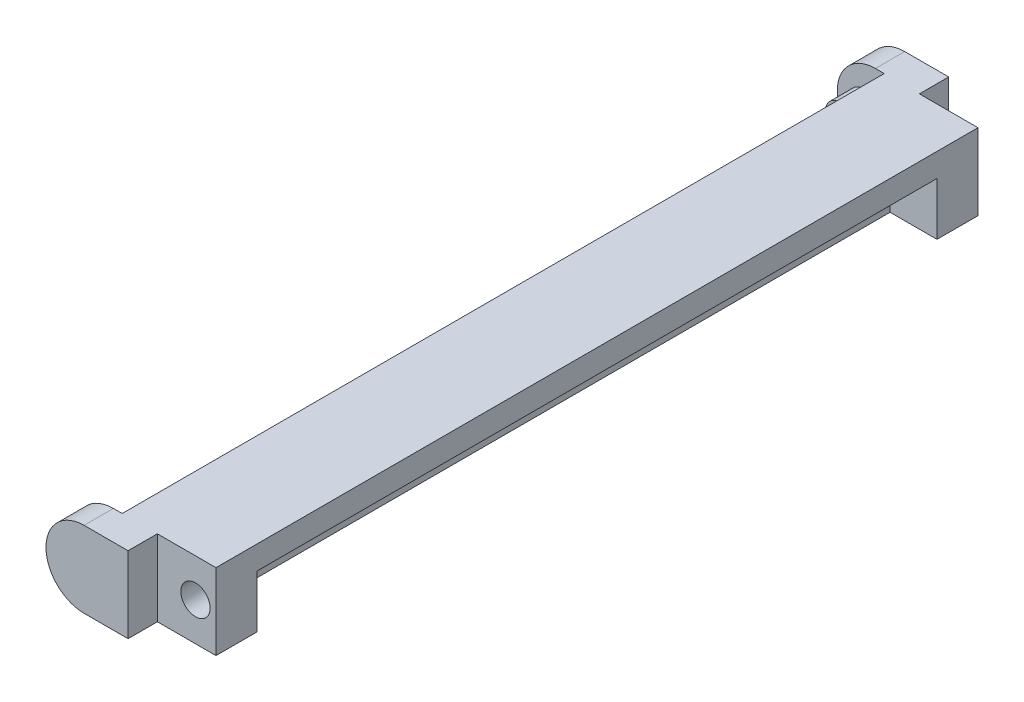
ISO-10303-21;
HEADER;
FILE_DESCRIPTION(('STEP AP214'),'2;1');
FILE_NAME('part.step','',(''),(''),'','','');
FILE_SCHEMA(('AUTOMOTIVE_DESIGN { 1 0 10303 214 1 1 1 1 }'));
ENDSEC;
DATA;
#1=APPLICATION_CONTEXT('core data for automotive mechanical design processes');
#2=APPLICATION_PROTOCOL_DEFINITION('international standard','automotive_design',2000,#1);
#3=PRODUCT_CONTEXT('',#1,'mechanical');
#4=PRODUCT('Part','Part','',(#3));
#5=PRODUCT_RELATED_PRODUCT_CATEGORY('part','',(#4));
#6=PRODUCT_DEFINITION_FORMATION('','',#4);
#7=PRODUCT_DEFINITION_CONTEXT('part definition',#1,'design');
#8=PRODUCT_DEFINITION('design','',#6,#7);
#9=PRODUCT_DEFINITION_SHAPE('','',#8);
#10=(LENGTH_UNIT() NAMED_UNIT(*) SI_UNIT(.MILLI.,.METRE.));
#11=(NAMED_UNIT(*) PLANE_ANGLE_UNIT() SI_UNIT($,.RADIAN.));
#12=(NAMED_UNIT(*) SI_UNIT($,.STERADIAN.) SOLID_ANGLE_UNIT());
#13=UNCERTAINTY_MEASURE_WITH_UNIT(LENGTH_MEASURE(1.E-05),#10,'distance_accuracy_value','');
#14=(GEOMETRIC_REPRESENTATION_CONTEXT(3) GLOBAL_UNCERTAINTY_ASSIGNED_CONTEXT((#13)) GLOBAL_UNIT_ASSIGNED_CONTEXT((#10,
#11,#12)) REPRESENTATION_CONTEXT('',''));
#15=CARTESIAN_POINT('',(0.,0.,0.));
#16=DIRECTION('',(0.,0.,1.));
#17=DIRECTION('',(1.,0.,0.));
#18=AXIS2_PLACEMENT_3D('',#15,#16,#17);
#19=CARTESIAN_POINT('',(6.5,-6.5,32.5));
#20=DIRECTION('',(1.,0.,0.));
#21=DIRECTION('',(0.,0.,-1.));
#22=AXIS2_PLACEMENT_3D('',#19,#20,#21);
#23=PLANE('',#22);
#24=DIRECTION('',(0.,0.,1.));
#25=VECTOR('',#24,1.);
#26=CARTESIAN_POINT('',(6.5,-2.,29.));
#27=LINE('',#26,#25);
#28=CARTESIAN_POINT('',(6.50000000000001,-2.,-29.));
#29=VERTEX_POINT('',#28);
#30=CARTESIAN_POINT('',(6.5,-2.,29.));
#31=VERTEX_POINT('',#30);
#32=EDGE_CURVE('E181',#29,#31,#27,.T.);
#33=ORIENTED_EDGE('',*,*,#32,.F.);
#34=DIRECTION('',(0.,-1.,0.));
#35=VECTOR('',#34,1.);
#36=CARTESIAN_POINT('',(6.50000000000001,-2.,-29.));
#37=LINE('',#36,#35);
#38=CARTESIAN_POINT('',(6.50000000000001,-6.5,-29.));
#39=VERTEX_POINT('',#38);
#40=EDGE_CURVE('E239',#29,#39,#37,.T.);
#41=ORIENTED_EDGE('',*,*,#40,.T.);
#42=DIRECTION('',(0.,0.,-1.));
#43=VECTOR('',#42,1.);
#44=CARTESIAN_POINT('',(6.5,-6.5,32.5));
#45=LINE('',#44,#43);
#46=CARTESIAN_POINT('',(6.5,-6.5,-32.5));
#47=VERTEX_POINT('',#46);
#48=EDGE_CURVE('E261',#39,#47,#45,.T.);
#49=ORIENTED_EDGE('',*,*,#48,.T.);
#50=DIRECTION('',(0.,1.,0.));
#51=VECTOR('',#50,1.);
#52=CARTESIAN_POINT('',(6.5,-6.5,-32.5));
#53=LINE('',#52,#51);
#54=CARTESIAN_POINT('',(6.5,0.,-32.5));
#55=VERTEX_POINT('',#54);
#56=EDGE_CURVE('E289',#47,#55,#53,.T.);
#57=ORIENTED_EDGE('',*,*,#56,.T.);
#58=DIRECTION('',(0.,0.,-1.));
#59=VECTOR('',#58,1.);
#60=CARTESIAN_POINT('',(6.5,0.,32.5));
#61=LINE('',#60,#59);
#62=CARTESIAN_POINT('',(6.5,0.,32.5));
#63=VERTEX_POINT('',#62);
#64=EDGE_CURVE('E260',#63,#55,#61,.T.);
#65=ORIENTED_EDGE('',*,*,#64,.F.);
#66=DIRECTION('',(0.,1.,0.));
#67=VECTOR('',#66,1.);
#68=CARTESIAN_POINT('',(6.5,-6.5,32.5));
#69=LINE('',#68,#67);
#70=CARTESIAN_POINT('',(6.5,-6.5,32.5));
#71=VERTEX_POINT('',#70);
#72=EDGE_CURVE('E328',#71,#63,#69,.T.);
#73=ORIENTED_EDGE('',*,*,#72,.F.);
#74=CARTESIAN_POINT('',(6.5,-6.5,29.));
#75=VERTEX_POINT('',#74);
#76=EDGE_CURVE('E197',#71,#75,#45,.T.);
#77=ORIENTED_EDGE('',*,*,#76,.T.);
#78=DIRECTION('',(0.,-1.,0.));
#79=VECTOR('',#78,1.);
#80=CARTESIAN_POINT('',(6.5,-2.,29.));
#81=LINE('',#80,#79);
#82=EDGE_CURVE('E178',#31,#75,#81,.T.);
#83=ORIENTED_EDGE('',*,*,#82,.F.);
#84=EDGE_LOOP('',(#33,#41,#49,#57,#65,#73,#77,#83));
#85=FACE_BOUND('',#84,.T.);
#86=ADVANCED_FACE('F47',(#85),#23,.T.);
#87=CARTESIAN_POINT('',(1.49999999999999,-6.5,35.));
#88=DIRECTION('',(0.,0.,1.));
#89=DIRECTION('',(1.,0.,0.));
#90=AXIS2_PLACEMENT_3D('',#87,#88,#89);
#91=PLANE('',#90);
#92=CARTESIAN_POINT('',(-2.25,-3.25,35.));
#93=DIRECTION('',(0.,0.,1.));
#94=DIRECTION('',(1.,0.,0.));
#95=AXIS2_PLACEMENT_3D('',#92,#93,#94);
#96=CIRCLE('',#95,3.25);
#97=CARTESIAN_POINT('',(-2.25,0.,35.));
#98=VERTEX_POINT('',#97);
#99=CARTESIAN_POINT('',(-2.25,-6.5,35.));
#100=VERTEX_POINT('',#99);
#101=EDGE_CURVE('E236',#98,#100,#96,.T.);
#102=ORIENTED_EDGE('',*,*,#101,.T.);
#103=DIRECTION('',(1.,0.,0.));
#104=VECTOR('',#103,1.);
#105=CARTESIAN_POINT('',(1.49999999999999,-6.5,35.));
#106=LINE('',#105,#104);
#107=CARTESIAN_POINT('',(1.49999999999999,-6.5,35.));
#108=VERTEX_POINT('',#107);
#109=EDGE_CURVE('E276',#100,#108,#106,.T.);
#110=ORIENTED_EDGE('',*,*,#109,.T.);
#111=DIRECTION('',(0.,1.,0.));
#112=VECTOR('',#111,1.);
#113=CARTESIAN_POINT('',(1.49999999999999,-6.5,35.));
#114=LINE('',#113,#112);
#115=CARTESIAN_POINT('',(1.49999999999999,0.,35.));
#116=VERTEX_POINT('',#115);
#117=EDGE_CURVE('E333',#108,#116,#114,.T.);
#118=ORIENTED_EDGE('',*,*,#117,.T.);
#119=DIRECTION('',(1.,0.,0.));
#120=VECTOR('',#119,1.);
#121=CARTESIAN_POINT('',(1.49999999999999,0.,35.));
#122=LINE('',#121,#120);
#123=EDGE_CURVE('E318',#98,#116,#122,.T.);
#124=ORIENTED_EDGE('',*,*,#123,.F.);
#125=EDGE_LOOP('',(#102,#110,#118,#124));
#126=FACE_BOUND('',#125,.T.);
#127=ADVANCED_FACE('F428',(#126),#91,.T.);
#128=CARTESIAN_POINT('',(-1.5,-6.5,32.5));
#129=DIRECTION('',(0.,0.,-1.));
#130=DIRECTION('',(-1.,0.,0.));
#131=AXIS2_PLACEMENT_3D('',#128,#129,#130);
#132=PLANE('',#131);
#133=CARTESIAN_POINT('',(-3.25,-3.25,32.5));
#134=DIRECTION('',(0.,0.,-1.));
#135=DIRECTION('',(-1.,0.,0.));
#136=AXIS2_PLACEMENT_3D('',#133,#134,#135);
#137=CIRCLE('',#136,1.25);
#138=CARTESIAN_POINT('',(-4.5,-3.25,32.5));
#139=VERTEX_POINT('',#138);
#140=EDGE_CURVE('E11',#139,#139,#137,.T.);
#141=ORIENTED_EDGE('',*,*,#140,.F.);
#142=EDGE_LOOP('',(#141));
#143=FACE_BOUND('',#142,.T.);
#144=DIRECTION('',(-1.,0.,0.));
#145=VECTOR('',#144,1.);
#146=CARTESIAN_POINT('',(-1.5,-6.5,32.5));
#147=LINE('',#146,#145);
#148=CARTESIAN_POINT('',(0.200000000000001,-6.5,32.5));
#149=VERTEX_POINT('',#148);
#150=CARTESIAN_POINT('',(-2.25,-6.5,32.5));
#151=VERTEX_POINT('',#150);
#152=EDGE_CURVE('E274',#149,#151,#147,.T.);
#153=ORIENTED_EDGE('',*,*,#152,.T.);
#154=CARTESIAN_POINT('',(-2.25,-3.25,32.5));
#155=DIRECTION('',(0.,0.,-1.));
#156=DIRECTION('',(-1.,0.,0.));
#157=AXIS2_PLACEMENT_3D('',#154,#155,#156);
#158=CIRCLE('',#157,3.25);
#159=CARTESIAN_POINT('',(-2.25,0.,32.5));
#160=VERTEX_POINT('',#159);
#161=EDGE_CURVE('E251',#151,#160,#158,.T.);
#162=ORIENTED_EDGE('',*,*,#161,.T.);
#163=DIRECTION('',(-1.,0.,0.));
#164=VECTOR('',#163,1.);
#165=CARTESIAN_POINT('',(-1.5,0.,32.5));
#166=LINE('',#165,#164);
#167=CARTESIAN_POINT('',(-1.5,0.,32.5));
#168=VERTEX_POINT('',#167);
#169=EDGE_CURVE('E314',#168,#160,#166,.T.);
#170=ORIENTED_EDGE('',*,*,#169,.F.);
#171=DIRECTION('',(0.,1.,0.));
#172=VECTOR('',#171,1.);
#173=CARTESIAN_POINT('',(-1.5,-6.5,32.5));
#174=LINE('',#173,#172);
#175=CARTESIAN_POINT('',(-1.5,-2.,32.5));
#176=VERTEX_POINT('',#175);
#177=EDGE_CURVE('E338',#176,#168,#174,.T.);
#178=ORIENTED_EDGE('',*,*,#177,.F.);
#179=DIRECTION('',(-1.,0.,0.));
#180=VECTOR('',#179,1.);
#181=CARTESIAN_POINT('',(-1.5,-2.,32.5));
#182=LINE('',#181,#180);
#183=CARTESIAN_POINT('',(0.200000000000001,-2.,32.5));
#184=VERTEX_POINT('',#183);
#185=EDGE_CURVE('E209',#184,#176,#182,.T.);
#186=ORIENTED_EDGE('',*,*,#185,.F.);
#187=DIRECTION('',(0.,-1.,0.));
#188=VECTOR('',#187,1.);
#189=CARTESIAN_POINT('',(0.200000000000001,-2.,32.5));
#190=LINE('',#189,#188);
#191=EDGE_CURVE('E211',#184,#149,#190,.T.);
#192=ORIENTED_EDGE('',*,*,#191,.T.);
#193=EDGE_LOOP('',(#153,#162,#170,#178,#186,#192));
#194=FACE_BOUND('',#193,.T.);
#195=ADVANCED_FACE('F420',(#143,#194),#132,.T.);
#196=CARTESIAN_POINT('',(-1.5,-6.5,-32.5));
#197=DIRECTION('',(0.,0.,1.));
#198=DIRECTION('',(1.,0.,0.));
#199=AXIS2_PLACEMENT_3D('',#196,#197,#198);
#200=PLANE('',#199);
#201=CARTESIAN_POINT('',(-3.25,-3.25,-32.5));
#202=DIRECTION('',(0.,0.,1.));
#203=DIRECTION('',(1.,0.,0.));
#204=AXIS2_PLACEMENT_3D('',#201,#202,#203);
#205=CIRCLE('',#204,1.25);
#206=CARTESIAN_POINT('',(-2.,-3.25,-32.5));
#207=VERTEX_POINT('',#206);
#208=EDGE_CURVE('E480',#207,#207,#205,.T.);
#209=ORIENTED_EDGE('',*,*,#208,.F.);
#210=EDGE_LOOP('',(#209));
#211=FACE_BOUND('',#210,.T.);
#212=CARTESIAN_POINT('',(-2.25,-3.25,-32.5));
#213=DIRECTION('',(0.,0.,1.));
#214=DIRECTION('',(1.,0.,0.));
#215=AXIS2_PLACEMENT_3D('',#212,#213,#214);
#216=CIRCLE('',#215,3.25);
#217=CARTESIAN_POINT('',(-2.25,0.,-32.5));
#218=VERTEX_POINT('',#217);
#219=CARTESIAN_POINT('',(-2.25,-6.5,-32.5));
#220=VERTEX_POINT('',#219);
#221=EDGE_CURVE('E246',#218,#220,#216,.T.);
#222=ORIENTED_EDGE('',*,*,#221,.T.);
#223=DIRECTION('',(1.,0.,0.));
#224=VECTOR('',#223,1.);
#225=CARTESIAN_POINT('',(-1.5,-6.5,-32.5));
#226=LINE('',#225,#224);
#227=CARTESIAN_POINT('',(0.200000000000009,-6.5,-32.5));
#228=VERTEX_POINT('',#227);
#229=EDGE_CURVE('E75',#220,#228,#226,.T.);
#230=ORIENTED_EDGE('',*,*,#229,.T.);
#231=DIRECTION('',(0.,-1.,0.));
#232=VECTOR('',#231,1.);
#233=CARTESIAN_POINT('',(0.200000000000009,-2.,-32.5));
#234=LINE('',#233,#232);
#235=CARTESIAN_POINT('',(0.200000000000009,-2.,-32.5));
#236=VERTEX_POINT('',#235);
#237=EDGE_CURVE('E210',#236,#228,#234,.T.);
#238=ORIENTED_EDGE('',*,*,#237,.F.);
#239=DIRECTION('',(1.,0.,0.));
#240=VECTOR('',#239,1.);
#241=CARTESIAN_POINT('',(-1.5,-2.,-32.5));
#242=LINE('',#241,#240);
#243=CARTESIAN_POINT('',(-1.5,-2.,-32.5));
#244=VERTEX_POINT('',#243);
#245=EDGE_CURVE('E227',#244,#236,#242,.T.);
#246=ORIENTED_EDGE('',*,*,#245,.F.);
#247=DIRECTION('',(0.,1.,0.));
#248=VECTOR('',#247,1.);
#249=CARTESIAN_POINT('',(-1.5,-6.5,-32.5));
#250=LINE('',#249,#248);
#251=CARTESIAN_POINT('',(-1.5,0.,-32.5));
#252=VERTEX_POINT('',#251);
#253=EDGE_CURVE('E345',#244,#252,#250,.T.);
#254=ORIENTED_EDGE('',*,*,#253,.T.);
#255=DIRECTION('',(1.,0.,0.));
#256=VECTOR('',#255,1.);
#257=CARTESIAN_POINT('',(-1.5,0.,-32.5));
#258=LINE('',#257,#256);
#259=EDGE_CURVE('E308',#218,#252,#258,.T.);
#260=ORIENTED_EDGE('',*,*,#259,.F.);
#261=EDGE_LOOP('',(#222,#230,#238,#246,#254,#260));
#262=FACE_BOUND('',#261,.T.);
#263=ADVANCED_FACE('F403',(#211,#262),#200,.T.);
#264=CARTESIAN_POINT('',(1.49999999999999,-6.5,32.5));
#265=DIRECTION('',(0.,0.,1.));
#266=DIRECTION('',(1.,0.,0.));
#267=AXIS2_PLACEMENT_3D('',#264,#265,#266);
#268=PLANE('',#267);
#269=CARTESIAN_POINT('',(4.75,-3.25,32.5));
#270=DIRECTION('',(0.,0.,-1.));
#271=DIRECTION('',(-1.,0.,0.));
#272=AXIS2_PLACEMENT_3D('',#269,#270,#271);
#273=CIRCLE('',#272,1.25);
#274=CARTESIAN_POINT('',(3.5,-3.25,32.5));
#275=VERTEX_POINT('',#274);
#276=EDGE_CURVE('E666',#275,#275,#273,.T.);
#277=ORIENTED_EDGE('',*,*,#276,.T.);
#278=EDGE_LOOP('',(#277));
#279=FACE_BOUND('',#278,.T.);
#280=DIRECTION('',(1.,0.,0.));
#281=VECTOR('',#280,1.);
#282=CARTESIAN_POINT('',(1.49999999999999,0.,32.5));
#283=LINE('',#282,#281);
#284=CARTESIAN_POINT('',(1.49999999999999,0.,32.5));
#285=VERTEX_POINT('',#284);
#286=EDGE_CURVE('E324',#285,#63,#283,.T.);
#287=ORIENTED_EDGE('',*,*,#286,.F.);
#288=DIRECTION('',(0.,1.,0.));
#289=VECTOR('',#288,1.);
#290=CARTESIAN_POINT('',(1.49999999999999,-6.5,32.5));
#291=LINE('',#290,#289);
#292=CARTESIAN_POINT('',(1.49999999999999,-6.5,32.5));
#293=VERTEX_POINT('',#292);
#294=EDGE_CURVE('E335',#293,#285,#291,.T.);
#295=ORIENTED_EDGE('',*,*,#294,.F.);
#296=DIRECTION('',(1.,0.,0.));
#297=VECTOR('',#296,1.);
#298=CARTESIAN_POINT('',(1.49999999999999,-6.5,32.5));
#299=LINE('',#298,#297);
#300=EDGE_CURVE('E288',#293,#71,#299,.T.);
#301=ORIENTED_EDGE('',*,*,#300,.T.);
#302=ORIENTED_EDGE('',*,*,#72,.T.);
#303=EDGE_LOOP('',(#287,#295,#301,#302));
#304=FACE_BOUND('',#303,.T.);
#305=ADVANCED_FACE('F365',(#279,#304),#268,.T.);
#306=CARTESIAN_POINT('',(1.49999999999999,-6.5,32.5));
#307=DIRECTION('',(1.,0.,0.));
#308=DIRECTION('',(0.,0.,-1.));
#309=AXIS2_PLACEMENT_3D('',#306,#307,#308);
#310=PLANE('',#309);
#311=DIRECTION('',(0.,0.,-1.));
#312=VECTOR('',#311,1.);
#313=CARTESIAN_POINT('',(1.49999999999999,0.,32.5));
#314=LINE('',#313,#312);
#315=EDGE_CURVE('E321',#116,#285,#314,.T.);
#316=ORIENTED_EDGE('',*,*,#315,.F.);
#317=ORIENTED_EDGE('',*,*,#117,.F.);
#318=DIRECTION('',(0.,0.,-1.));
#319=VECTOR('',#318,1.);
#320=CARTESIAN_POINT('',(1.49999999999999,-6.5,32.5));
#321=LINE('',#320,#319);
#322=EDGE_CURVE('E282',#108,#293,#321,.T.);
#323=ORIENTED_EDGE('',*,*,#322,.T.);
#324=ORIENTED_EDGE('',*,*,#294,.T.);
#325=EDGE_LOOP('',(#316,#317,#323,#324));
#326=FACE_BOUND('',#325,.T.);
#327=ADVANCED_FACE('F429',(#326),#310,.T.);
#328=CARTESIAN_POINT('',(-1.5,-6.5,32.5));
#329=DIRECTION('',(-1.,0.,0.));
#330=DIRECTION('',(0.,0.,1.));
#331=AXIS2_PLACEMENT_3D('',#328,#329,#330);
#332=PLANE('',#331);
#333=DIRECTION('',(0.,0.,-1.));
#334=VECTOR('',#333,1.);
#335=CARTESIAN_POINT('',(-1.5,-2.,32.5));
#336=LINE('',#335,#334);
#337=EDGE_CURVE('E219',#176,#244,#336,.T.);
#338=ORIENTED_EDGE('',*,*,#337,.F.);
#339=ORIENTED_EDGE('',*,*,#177,.T.);
#340=DIRECTION('',(0.,0.,1.));
#341=VECTOR('',#340,1.);
#342=CARTESIAN_POINT('',(-1.5,0.,32.5));
#343=LINE('',#342,#341);
#344=EDGE_CURVE('E309',#252,#168,#343,.T.);
#345=ORIENTED_EDGE('',*,*,#344,.F.);
#346=ORIENTED_EDGE('',*,*,#253,.F.);
#347=EDGE_LOOP('',(#338,#339,#345,#346));
#348=FACE_BOUND('',#347,.T.);
#349=ADVANCED_FACE('F411',(#348),#332,.T.);
#350=CARTESIAN_POINT('',(1.49999999999999,-6.5,-35.));
#351=DIRECTION('',(0.,0.,-1.));
#352=DIRECTION('',(-1.,0.,0.));
#353=AXIS2_PLACEMENT_3D('',#350,#351,#352);
#354=PLANE('',#353);
#355=DIRECTION('',(-1.,0.,0.));
#356=VECTOR('',#355,1.);
#357=CARTESIAN_POINT('',(1.49999999999999,-6.5,-35.));
#358=LINE('',#357,#356);
#359=CARTESIAN_POINT('',(1.49999999999999,-6.5,-35.));
#360=VERTEX_POINT('',#359);
#361=CARTESIAN_POINT('',(-2.25,-6.5,-35.));
#362=VERTEX_POINT('',#361);
#363=EDGE_CURVE('E267',#360,#362,#358,.T.);
#364=ORIENTED_EDGE('',*,*,#363,.T.);
#365=CARTESIAN_POINT('',(-2.25,-3.25,-35.));
#366=DIRECTION('',(0.,0.,1.));
#367=DIRECTION('',(1.,0.,0.));
#368=AXIS2_PLACEMENT_3D('',#365,#366,#367);
#369=CIRCLE('',#368,3.25);
#370=CARTESIAN_POINT('',(-2.25,0.,-35.));
#371=VERTEX_POINT('',#370);
#372=EDGE_CURVE('E238',#371,#362,#369,.T.);
#373=ORIENTED_EDGE('',*,*,#372,.F.);
#374=DIRECTION('',(-1.,0.,0.));
#375=VECTOR('',#374,1.);
#376=CARTESIAN_POINT('',(1.49999999999999,0.,-35.));
#377=LINE('',#376,#375);
#378=CARTESIAN_POINT('',(1.49999999999999,0.,-35.));
#379=VERTEX_POINT('',#378);
#380=EDGE_CURVE('E304',#379,#371,#377,.T.);
#381=ORIENTED_EDGE('',*,*,#380,.F.);
#382=DIRECTION('',(0.,1.,0.));
#383=VECTOR('',#382,1.);
#384=CARTESIAN_POINT('',(1.49999999999999,-6.5,-35.));
#385=LINE('',#384,#383);
#386=EDGE_CURVE('E344',#360,#379,#385,.T.);
#387=ORIENTED_EDGE('',*,*,#386,.F.);
#388=EDGE_LOOP('',(#364,#373,#381,#387));
#389=FACE_BOUND('',#388,.T.);
#390=ADVANCED_FACE('F400',(#389),#354,.T.);
#391=CARTESIAN_POINT('',(1.49999999999999,-6.5,-32.5));
#392=DIRECTION('',(1.,0.,0.));
#393=DIRECTION('',(0.,0.,-1.));
#394=AXIS2_PLACEMENT_3D('',#391,#392,#393);
#395=PLANE('',#394);
#396=DIRECTION('',(0.,0.,-1.));
#397=VECTOR('',#396,1.);
#398=CARTESIAN_POINT('',(1.49999999999999,0.,-32.5));
#399=LINE('',#398,#397);
#400=CARTESIAN_POINT('',(1.49999999999999,0.,-32.5));
#401=VERTEX_POINT('',#400);
#402=EDGE_CURVE('E299',#401,#379,#399,.T.);
#403=ORIENTED_EDGE('',*,*,#402,.F.);
#404=DIRECTION('',(0.,1.,0.));
#405=VECTOR('',#404,1.);
#406=CARTESIAN_POINT('',(1.49999999999999,-6.5,-32.5));
#407=LINE('',#406,#405);
#408=CARTESIAN_POINT('',(1.49999999999999,-6.5,-32.5));
#409=VERTEX_POINT('',#408);
#410=EDGE_CURVE('E346',#409,#401,#407,.T.);
#411=ORIENTED_EDGE('',*,*,#410,.F.);
#412=DIRECTION('',(0.,0.,-1.));
#413=VECTOR('',#412,1.);
#414=CARTESIAN_POINT('',(1.49999999999999,-6.5,-32.5));
#415=LINE('',#414,#413);
#416=EDGE_CURVE('E264',#409,#360,#415,.T.);
#417=ORIENTED_EDGE('',*,*,#416,.T.);
#418=ORIENTED_EDGE('',*,*,#386,.T.);
#419=EDGE_LOOP('',(#403,#411,#417,#418));
#420=FACE_BOUND('',#419,.T.);
#421=ADVANCED_FACE('F392',(#420),#395,.T.);
#422=CARTESIAN_POINT('',(1.49999999999999,-6.5,-32.5));
#423=DIRECTION('',(0.,0.,-1.));
#424=DIRECTION('',(-1.,0.,0.));
#425=AXIS2_PLACEMENT_3D('',#422,#423,#424);
#426=PLANE('',#425);
#427=CARTESIAN_POINT('',(4.75,-3.25,-32.5));
#428=DIRECTION('',(0.,0.,-1.));
#429=DIRECTION('',(-1.,0.,0.));
#430=AXIS2_PLACEMENT_3D('',#427,#428,#429);
#431=CIRCLE('',#430,1.25);
#432=CARTESIAN_POINT('',(3.5,-3.25,-32.5));
#433=VERTEX_POINT('',#432);
#434=EDGE_CURVE('E470',#433,#433,#431,.T.);
#435=ORIENTED_EDGE('',*,*,#434,.F.);
#436=EDGE_LOOP('',(#435));
#437=FACE_BOUND('',#436,.T.);
#438=DIRECTION('',(-1.,0.,0.));
#439=VECTOR('',#438,1.);
#440=CARTESIAN_POINT('',(1.49999999999999,0.,-32.5));
#441=LINE('',#440,#439);
#442=EDGE_CURVE('E294',#55,#401,#441,.T.);
#443=ORIENTED_EDGE('',*,*,#442,.F.);
#444=ORIENTED_EDGE('',*,*,#56,.F.);
#445=DIRECTION('',(-1.,0.,0.));
#446=VECTOR('',#445,1.);
#447=CARTESIAN_POINT('',(1.49999999999999,-6.5,-32.5));
#448=LINE('',#447,#446);
#449=EDGE_CURVE('E257',#47,#409,#448,.T.);
#450=ORIENTED_EDGE('',*,*,#449,.T.);
#451=ORIENTED_EDGE('',*,*,#410,.T.);
#452=EDGE_LOOP('',(#443,#444,#450,#451));
#453=FACE_BOUND('',#452,.T.);
#454=ADVANCED_FACE('F359',(#437,#453),#426,.T.);
#455=CARTESIAN_POINT('',(0.,-6.5,0.));
#456=DIRECTION('',(0.,-1.,0.));
#457=DIRECTION('',(0.,0.,-1.));
#458=AXIS2_PLACEMENT_3D('',#455,#456,#457);
#459=PLANE('',#458);
#460=DIRECTION('',(-1.,0.,0.));
#461=VECTOR('',#460,1.);
#462=CARTESIAN_POINT('',(6.5,-6.5,29.));
#463=LINE('',#462,#461);
#464=CARTESIAN_POINT('',(2.5,-6.5,29.));
#465=VERTEX_POINT('',#464);
#466=EDGE_CURVE('E63',#75,#465,#463,.T.);
#467=ORIENTED_EDGE('',*,*,#466,.F.);
#468=ORIENTED_EDGE('',*,*,#76,.F.);
#469=ORIENTED_EDGE('',*,*,#300,.F.);
#470=ORIENTED_EDGE('',*,*,#322,.F.);
#471=ORIENTED_EDGE('',*,*,#109,.F.);
#472=DIRECTION('',(0.,0.,1.));
#473=VECTOR('',#472,1.);
#474=CARTESIAN_POINT('',(-2.25,-6.5,-35.));
#475=LINE('',#474,#473);
#476=EDGE_CURVE('E60',#151,#100,#475,.T.);
#477=ORIENTED_EDGE('',*,*,#476,.F.);
#478=ORIENTED_EDGE('',*,*,#152,.F.);
#479=DIRECTION('',(0.,0.,1.));
#480=VECTOR('',#479,1.);
#481=CARTESIAN_POINT('',(0.200000000000001,-6.5,32.5));
#482=LINE('',#481,#480);
#483=EDGE_CURVE('E216',#228,#149,#482,.T.);
#484=ORIENTED_EDGE('',*,*,#483,.F.);
#485=ORIENTED_EDGE('',*,*,#229,.F.);
#486=EDGE_CURVE('E232',#362,#220,#475,.T.);
#487=ORIENTED_EDGE('',*,*,#486,.F.);
#488=ORIENTED_EDGE('',*,*,#363,.F.);
#489=ORIENTED_EDGE('',*,*,#416,.F.);
#490=ORIENTED_EDGE('',*,*,#449,.F.);
#491=ORIENTED_EDGE('',*,*,#48,.F.);
#492=DIRECTION('',(1.,0.,0.));
#493=VECTOR('',#492,1.);
#494=CARTESIAN_POINT('',(6.50000000000001,-6.5,-29.));
#495=LINE('',#494,#493);
#496=CARTESIAN_POINT('',(2.50000000000001,-6.5,-29.));
#497=VERTEX_POINT('',#496);
#498=EDGE_CURVE('E195',#497,#39,#495,.T.);
#499=ORIENTED_EDGE('',*,*,#498,.F.);
#500=DIRECTION('',(0.,0.,-1.));
#501=VECTOR('',#500,1.);
#502=CARTESIAN_POINT('',(2.5,-6.5,29.));
#503=LINE('',#502,#501);
#504=EDGE_CURVE('E375',#465,#497,#503,.T.);
#505=ORIENTED_EDGE('',*,*,#504,.F.);
#506=EDGE_LOOP('',(#467,#468,#469,#470,#471,#477,#478,#484,#485,#487,#488,#489,#490,#491,#499,#505));
#507=FACE_BOUND('',#506,.T.);
#508=ADVANCED_FACE('F370',(#507),#459,.T.);
#509=CARTESIAN_POINT('',(0.,0.,0.));
#510=DIRECTION('',(0.,-1.,0.));
#511=DIRECTION('',(0.,0.,-1.));
#512=AXIS2_PLACEMENT_3D('',#509,#510,#511);
#513=PLANE('',#512);
#514=ORIENTED_EDGE('',*,*,#380,.T.);
#515=DIRECTION('',(0.,0.,1.));
#516=VECTOR('',#515,1.);
#517=CARTESIAN_POINT('',(-2.25,0.,-35.));
#518=LINE('',#517,#516);
#519=EDGE_CURVE('E244',#371,#218,#518,.T.);
#520=ORIENTED_EDGE('',*,*,#519,.T.);
#521=ORIENTED_EDGE('',*,*,#259,.T.);
#522=ORIENTED_EDGE('',*,*,#344,.T.);
#523=ORIENTED_EDGE('',*,*,#169,.T.);
#524=EDGE_CURVE('E248',#160,#98,#518,.T.);
#525=ORIENTED_EDGE('',*,*,#524,.T.);
#526=ORIENTED_EDGE('',*,*,#123,.T.);
#527=ORIENTED_EDGE('',*,*,#315,.T.);
#528=ORIENTED_EDGE('',*,*,#286,.T.);
#529=ORIENTED_EDGE('',*,*,#64,.T.);
#530=ORIENTED_EDGE('',*,*,#442,.T.);
#531=ORIENTED_EDGE('',*,*,#402,.T.);
#532=EDGE_LOOP('',(#514,#520,#521,#522,#523,#525,#526,#527,#528,#529,#530,#531));
#533=FACE_BOUND('',#532,.T.);
#534=ADVANCED_FACE('F358',(#533),#513,.F.);
#535=CARTESIAN_POINT('',(-2.25,-3.25,-35.));
#536=DIRECTION('',(0.,0.,1.));
#537=DIRECTION('',(1.,0.,0.));
#538=AXIS2_PLACEMENT_3D('',#535,#536,#537);
#539=CYLINDRICAL_SURFACE('',#538,3.25);
#540=ORIENTED_EDGE('',*,*,#519,.F.);
#541=ORIENTED_EDGE('',*,*,#372,.T.);
#542=ORIENTED_EDGE('',*,*,#486,.T.);
#543=ORIENTED_EDGE('',*,*,#221,.F.);
#544=EDGE_LOOP('',(#540,#541,#542,#543));
#545=FACE_BOUND('',#544,.T.);
#546=ADVANCED_FACE('F397',(#545),#539,.T.);
#547=ORIENTED_EDGE('',*,*,#161,.F.);
#548=ORIENTED_EDGE('',*,*,#476,.T.);
#549=ORIENTED_EDGE('',*,*,#101,.F.);
#550=ORIENTED_EDGE('',*,*,#524,.F.);
#551=EDGE_LOOP('',(#547,#548,#549,#550));
#552=FACE_BOUND('',#551,.T.);
#553=ADVANCED_FACE('F425',(#552),#539,.T.);
#554=CARTESIAN_POINT('',(0.200000000000001,-2.,32.5));
#555=DIRECTION('',(1.,0.,0.));
#556=DIRECTION('',(0.,0.,-1.));
#557=AXIS2_PLACEMENT_3D('',#554,#555,#556);
#558=PLANE('',#557);
#559=ORIENTED_EDGE('',*,*,#483,.T.);
#560=ORIENTED_EDGE('',*,*,#191,.F.);
#561=DIRECTION('',(0.,0.,1.));
#562=VECTOR('',#561,1.);
#563=CARTESIAN_POINT('',(0.200000000000001,-2.,32.5));
#564=LINE('',#563,#562);
#565=EDGE_CURVE('E224',#236,#184,#564,.T.);
#566=ORIENTED_EDGE('',*,*,#565,.F.);
#567=ORIENTED_EDGE('',*,*,#237,.T.);
#568=EDGE_LOOP('',(#559,#560,#566,#567));
#569=FACE_BOUND('',#568,.T.);
#570=ADVANCED_FACE('F401',(#569),#558,.F.);
#571=CARTESIAN_POINT('',(0.,-2.,0.));
#572=DIRECTION('',(0.,-1.,0.));
#573=DIRECTION('',(0.,0.,-1.));
#574=AXIS2_PLACEMENT_3D('',#571,#572,#573);
#575=PLANE('',#574);
#576=ORIENTED_EDGE('',*,*,#337,.T.);
#577=ORIENTED_EDGE('',*,*,#245,.T.);
#578=ORIENTED_EDGE('',*,*,#565,.T.);
#579=ORIENTED_EDGE('',*,*,#185,.T.);
#580=EDGE_LOOP('',(#576,#577,#578,#579));
#581=FACE_BOUND('',#580,.T.);
#582=ADVANCED_FACE('F408',(#581),#575,.T.);
#583=CARTESIAN_POINT('',(6.50000000000001,-2.,-29.));
#584=DIRECTION('',(0.,0.,-1.));
#585=DIRECTION('',(-1.,0.,0.));
#586=AXIS2_PLACEMENT_3D('',#583,#584,#585);
#587=PLANE('',#586);
#588=ORIENTED_EDGE('',*,*,#498,.T.);
#589=ORIENTED_EDGE('',*,*,#40,.F.);
#590=DIRECTION('',(1.,0.,0.));
#591=VECTOR('',#590,1.);
#592=CARTESIAN_POINT('',(6.50000000000001,-2.,-29.));
#593=LINE('',#592,#591);
#594=CARTESIAN_POINT('',(2.50000000000001,-2.,-29.));
#595=VERTEX_POINT('',#594);
#596=EDGE_CURVE('E188',#595,#29,#593,.T.);
#597=ORIENTED_EDGE('',*,*,#596,.F.);
#598=DIRECTION('',(0.,-1.,0.));
#599=VECTOR('',#598,1.);
#600=CARTESIAN_POINT('',(2.50000000000001,-2.,-29.));
#601=LINE('',#600,#599);
#602=EDGE_CURVE('E205',#595,#497,#601,.T.);
#603=ORIENTED_EDGE('',*,*,#602,.T.);
#604=EDGE_LOOP('',(#588,#589,#597,#603));
#605=FACE_BOUND('',#604,.T.);
#606=ADVANCED_FACE('F383',(#605),#587,.F.);
#607=CARTESIAN_POINT('',(2.5,-2.,29.));
#608=DIRECTION('',(-1.,0.,0.));
#609=DIRECTION('',(0.,0.,1.));
#610=AXIS2_PLACEMENT_3D('',#607,#608,#609);
#611=PLANE('',#610);
#612=ORIENTED_EDGE('',*,*,#504,.T.);
#613=ORIENTED_EDGE('',*,*,#602,.F.);
#614=DIRECTION('',(0.,0.,-1.));
#615=VECTOR('',#614,1.);
#616=CARTESIAN_POINT('',(2.5,-2.,29.));
#617=LINE('',#616,#615);
#618=CARTESIAN_POINT('',(2.5,-2.,29.));
#619=VERTEX_POINT('',#618);
#620=EDGE_CURVE('E185',#619,#595,#617,.T.);
#621=ORIENTED_EDGE('',*,*,#620,.F.);
#622=DIRECTION('',(0.,-1.,0.));
#623=VECTOR('',#622,1.);
#624=CARTESIAN_POINT('',(2.5,-2.,29.));
#625=LINE('',#624,#623);
#626=EDGE_CURVE('E180',#619,#465,#625,.T.);
#627=ORIENTED_EDGE('',*,*,#626,.T.);
#628=EDGE_LOOP('',(#612,#613,#621,#627));
#629=FACE_BOUND('',#628,.T.);
#630=ADVANCED_FACE('F387',(#629),#611,.F.);
#631=CARTESIAN_POINT('',(6.5,-2.,29.));
#632=DIRECTION('',(0.,0.,1.));
#633=DIRECTION('',(1.,0.,0.));
#634=AXIS2_PLACEMENT_3D('',#631,#632,#633);
#635=PLANE('',#634);
#636=ORIENTED_EDGE('',*,*,#466,.T.);
#637=ORIENTED_EDGE('',*,*,#626,.F.);
#638=DIRECTION('',(-1.,0.,0.));
#639=VECTOR('',#638,1.);
#640=CARTESIAN_POINT('',(6.5,-2.,29.));
#641=LINE('',#640,#639);
#642=EDGE_CURVE('E172',#31,#619,#641,.T.);
#643=ORIENTED_EDGE('',*,*,#642,.F.);
#644=ORIENTED_EDGE('',*,*,#82,.T.);
#645=EDGE_LOOP('',(#636,#637,#643,#644));
#646=FACE_BOUND('',#645,.T.);
#647=ADVANCED_FACE('F173',(#646),#635,.F.);
#648=CARTESIAN_POINT('',(0.,-2.,0.));
#649=DIRECTION('',(0.,1.,0.));
#650=DIRECTION('',(0.,0.,1.));
#651=AXIS2_PLACEMENT_3D('',#648,#649,#650);
#652=PLANE('',#651);
#653=ORIENTED_EDGE('',*,*,#32,.T.);
#654=ORIENTED_EDGE('',*,*,#642,.T.);
#655=ORIENTED_EDGE('',*,*,#620,.T.);
#656=ORIENTED_EDGE('',*,*,#596,.T.);
#657=EDGE_LOOP('',(#653,#654,#655,#656));
#658=FACE_BOUND('',#657,.T.);
#659=ADVANCED_FACE('F187',(#658),#652,.F.);
#660=CARTESIAN_POINT('',(-3.25,-3.25,-30.5));
#661=DIRECTION('',(0.,0.,-1.));
#662=DIRECTION('',(-1.,0.,0.));
#663=AXIS2_PLACEMENT_3D('',#660,#661,#662);
#664=CYLINDRICAL_SURFACE('',#663,1.25);
#665=CARTESIAN_POINT('',(-3.25,-3.25,-30.5));
#666=DIRECTION('',(0.,0.,1.));
#667=DIRECTION('',(1.,0.,0.));
#668=AXIS2_PLACEMENT_3D('',#665,#666,#667);
#669=CIRCLE('',#668,1.25);
#670=CARTESIAN_POINT('',(-2.,-3.25,-30.5));
#671=VERTEX_POINT('',#670);
#672=EDGE_CURVE('E214',#671,#671,#669,.T.);
#673=ORIENTED_EDGE('',*,*,#672,.F.);
#674=EDGE_LOOP('',(#673));
#675=FACE_BOUND('',#674,.T.);
#676=ORIENTED_EDGE('',*,*,#208,.T.);
#677=EDGE_LOOP('',(#676));
#678=FACE_BOUND('',#677,.T.);
#679=ADVANCED_FACE('F491',(#675,#678),#664,.T.);
#680=CARTESIAN_POINT('',(-3.25,-3.25,-30.5));
#681=DIRECTION('',(0.,0.,1.));
#682=DIRECTION('',(1.,0.,0.));
#683=AXIS2_PLACEMENT_3D('',#680,#681,#682);
#684=PLANE('',#683);
#685=ORIENTED_EDGE('',*,*,#672,.T.);
#686=EDGE_LOOP('',(#685));
#687=FACE_BOUND('',#686,.T.);
#688=ADVANCED_FACE('F492',(#687),#684,.T.);
#689=CARTESIAN_POINT('',(4.75,-3.25,-30.5));
#690=DIRECTION('',(0.,0.,-1.));
#691=DIRECTION('',(-1.,0.,0.));
#692=AXIS2_PLACEMENT_3D('',#689,#690,#691);
#693=CYLINDRICAL_SURFACE('',#692,1.25);
#694=CARTESIAN_POINT('',(4.75,-3.25,-30.5));
#695=DIRECTION('',(0.,0.,-1.));
#696=DIRECTION('',(-1.,0.,0.));
#697=AXIS2_PLACEMENT_3D('',#694,#695,#696);
#698=CIRCLE('',#697,1.25);
#699=CARTESIAN_POINT('',(3.5,-3.25,-30.5));
#700=VERTEX_POINT('',#699);
#701=EDGE_CURVE('E473',#700,#700,#698,.T.);
#702=ORIENTED_EDGE('',*,*,#701,.F.);
#703=EDGE_LOOP('',(#702));
#704=FACE_BOUND('',#703,.T.);
#705=ORIENTED_EDGE('',*,*,#434,.T.);
#706=EDGE_LOOP('',(#705));
#707=FACE_BOUND('',#706,.T.);
#708=ADVANCED_FACE('F499',(#704,#707),#693,.F.);
#709=CARTESIAN_POINT('',(4.75,-3.25,-30.5));
#710=DIRECTION('',(0.,0.,-1.));
#711=DIRECTION('',(-1.,0.,0.));
#712=AXIS2_PLACEMENT_3D('',#709,#710,#711);
#713=PLANE('',#712);
#714=ORIENTED_EDGE('',*,*,#701,.T.);
#715=EDGE_LOOP('',(#714));
#716=FACE_BOUND('',#715,.T.);
#717=ADVANCED_FACE('F612',(#716),#713,.T.);
#718=CARTESIAN_POINT('',(-3.25,-3.25,30.5));
#719=DIRECTION('',(0.,0.,1.));
#720=DIRECTION('',(1.,0.,0.));
#721=AXIS2_PLACEMENT_3D('',#718,#719,#720);
#722=CYLINDRICAL_SURFACE('',#721,1.25);
#723=CARTESIAN_POINT('',(-3.25,-3.25,30.5));
#724=DIRECTION('',(0.,0.,1.));
#725=DIRECTION('',(1.,0.,0.));
#726=AXIS2_PLACEMENT_3D('',#723,#724,#725);
#727=CIRCLE('',#726,1.25);
#728=CARTESIAN_POINT('',(-2.,-3.25,30.5));
#729=VERTEX_POINT('',#728);
#730=EDGE_CURVE('E472',#729,#729,#727,.T.);
#731=ORIENTED_EDGE('',*,*,#730,.T.);
#732=EDGE_LOOP('',(#731));
#733=FACE_BOUND('',#732,.T.);
#734=ORIENTED_EDGE('',*,*,#140,.T.);
#735=EDGE_LOOP('',(#734));
#736=FACE_BOUND('',#735,.T.);
#737=ADVANCED_FACE('F619',(#733,#736),#722,.T.);
#738=CARTESIAN_POINT('',(-3.25,-3.25,30.5));
#739=DIRECTION('',(0.,0.,-1.));
#740=DIRECTION('',(1.,0.,0.));
#741=AXIS2_PLACEMENT_3D('',#738,#739,#740);
#742=PLANE('',#741);
#743=ORIENTED_EDGE('',*,*,#730,.F.);
#744=EDGE_LOOP('',(#743));
#745=FACE_BOUND('',#744,.T.);
#746=ADVANCED_FACE('F630',(#745),#742,.T.);
#747=CARTESIAN_POINT('',(4.75,-3.25,30.5));
#748=DIRECTION('',(0.,0.,1.));
#749=DIRECTION('',(1.,0.,0.));
#750=AXIS2_PLACEMENT_3D('',#747,#748,#749);
#751=CYLINDRICAL_SURFACE('',#750,1.25);
#752=CARTESIAN_POINT('',(4.75,-3.25,30.5));
#753=DIRECTION('',(0.,0.,-1.));
#754=DIRECTION('',(-1.,0.,0.));
#755=AXIS2_PLACEMENT_3D('',#752,#753,#754);
#756=CIRCLE('',#755,1.25);
#757=CARTESIAN_POINT('',(3.5,-3.25,30.5));
#758=VERTEX_POINT('',#757);
#759=EDGE_CURVE('E477',#758,#758,#756,.T.);
#760=ORIENTED_EDGE('',*,*,#759,.T.);
#761=EDGE_LOOP('',(#760));
#762=FACE_BOUND('',#761,.T.);
#763=ORIENTED_EDGE('',*,*,#276,.F.);
#764=EDGE_LOOP('',(#763));
#765=FACE_BOUND('',#764,.T.);
#766=ADVANCED_FACE('F639',(#762,#765),#751,.F.);
#767=CARTESIAN_POINT('',(4.75,-3.25,30.5));
#768=DIRECTION('',(0.,0.,1.));
#769=DIRECTION('',(-1.,0.,0.));
#770=AXIS2_PLACEMENT_3D('',#767,#768,#769);
#771=PLANE('',#770);
#772=ORIENTED_EDGE('',*,*,#759,.F.);
#773=EDGE_LOOP('',(#772));
#774=FACE_BOUND('',#773,.T.);
#775=ADVANCED_FACE('F649',(#774),#771,.T.);
#776=CLOSED_SHELL('',(#86,#127,#195,#263,#305,#327,#349,#390,#421,#454,#508,#534,#546,#553,#570,
#582,#606,#630,#647,#659,#679,#688,#708,#717,#737,#746,#766,#775));
#777=MANIFOLD_SOLID_BREP('B2',#776);
#778=ADVANCED_BREP_SHAPE_REPRESENTATION('',(#18,#777),#14);
#779=SHAPE_DEFINITION_REPRESENTATION(#9,#778);
ENDSEC;
END-ISO-10303-21;
